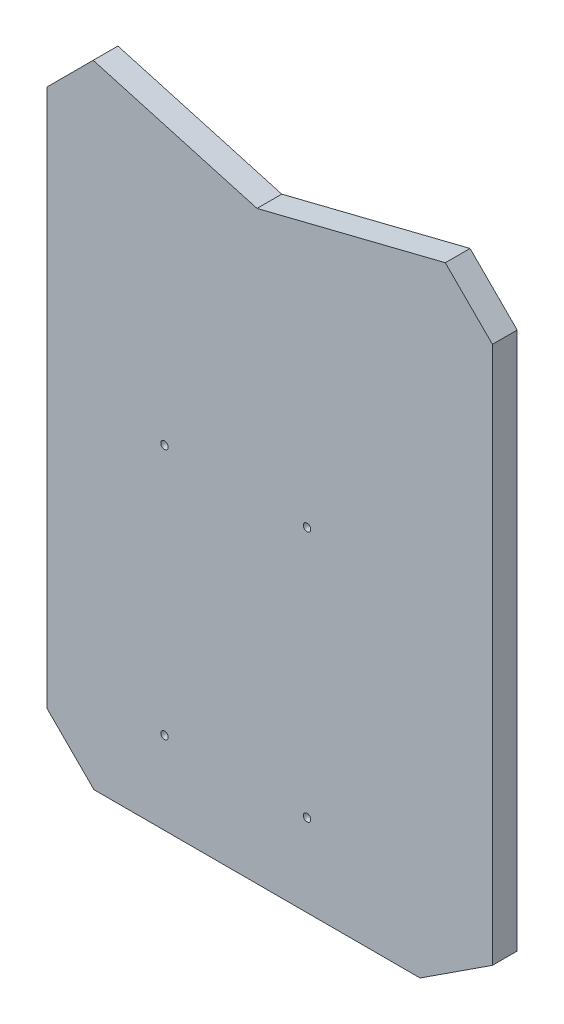
ISO-10303-21;
HEADER;
FILE_DESCRIPTION(('STEP AP214'),'2;1');
FILE_NAME('part.step','',(''),(''),'','','');
FILE_SCHEMA(('AUTOMOTIVE_DESIGN { 1 0 10303 214 1 1 1 1 }'));
ENDSEC;
DATA;
#1=APPLICATION_CONTEXT('core data for automotive mechanical design processes');
#2=APPLICATION_PROTOCOL_DEFINITION('international standard','automotive_design',2000,#1);
#3=PRODUCT_CONTEXT('',#1,'mechanical');
#4=PRODUCT('Part','Part','',(#3));
#5=PRODUCT_RELATED_PRODUCT_CATEGORY('part','',(#4));
#6=PRODUCT_DEFINITION_FORMATION('','',#4);
#7=PRODUCT_DEFINITION_CONTEXT('part definition',#1,'design');
#8=PRODUCT_DEFINITION('design','',#6,#7);
#9=PRODUCT_DEFINITION_SHAPE('','',#8);
#10=(LENGTH_UNIT() NAMED_UNIT(*) SI_UNIT(.MILLI.,.METRE.));
#11=(NAMED_UNIT(*) PLANE_ANGLE_UNIT() SI_UNIT($,.RADIAN.));
#12=(NAMED_UNIT(*) SI_UNIT($,.STERADIAN.) SOLID_ANGLE_UNIT());
#13=UNCERTAINTY_MEASURE_WITH_UNIT(LENGTH_MEASURE(1.E-05),#10,'distance_accuracy_value','');
#14=(GEOMETRIC_REPRESENTATION_CONTEXT(3) GLOBAL_UNCERTAINTY_ASSIGNED_CONTEXT((#13)) GLOBAL_UNIT_ASSIGNED_CONTEXT((#10,
#11,#12)) REPRESENTATION_CONTEXT('',''));
#15=CARTESIAN_POINT('',(0.,0.,0.));
#16=DIRECTION('',(0.,0.,1.));
#17=DIRECTION('',(1.,0.,0.));
#18=AXIS2_PLACEMENT_3D('',#15,#16,#17);
#19=CARTESIAN_POINT('',(-95.9896856118364,-47.8767409493786,10.));
#20=DIRECTION('',(-0.545817592000617,0.8379040256871,0.));
#21=DIRECTION('',(-0.8379040256871,-0.545817592000617,0.));
#22=AXIS2_PLACEMENT_3D('',#19,#20,#21);
#23=PLANE('',#22);
#24=DIRECTION('',(0.8379040256871,0.545817592000617,0.));
#25=VECTOR('',#24,1.);
#26=CARTESIAN_POINT('',(-95.9896856118364,-47.8767409493786,0.));
#27=LINE('',#26,#25);
#28=CARTESIAN_POINT('',(-125.221881909842,-66.9188346774557,0.));
#29=VERTEX_POINT('',#28);
#30=CARTESIAN_POINT('',(-95.9896856118364,-47.8767409493786,0.));
#31=VERTEX_POINT('',#30);
#32=EDGE_CURVE('E139',#29,#31,#27,.T.);
#33=ORIENTED_EDGE('',*,*,#32,.T.);
#34=DIRECTION('',(0.,0.,-1.));
#35=VECTOR('',#34,1.);
#36=CARTESIAN_POINT('',(-95.9896856118364,-47.8767409493786,10.));
#37=LINE('',#36,#35);
#38=CARTESIAN_POINT('',(-95.9896856118364,-47.8767409493786,10.));
#39=VERTEX_POINT('',#38);
#40=EDGE_CURVE('E11',#39,#31,#37,.T.);
#41=ORIENTED_EDGE('',*,*,#40,.F.);
#42=DIRECTION('',(0.8379040256871,0.545817592000617,0.));
#43=VECTOR('',#42,1.);
#44=CARTESIAN_POINT('',(-95.9896856118364,-47.8767409493786,10.));
#45=LINE('',#44,#43);
#46=CARTESIAN_POINT('',(-125.221881909842,-66.9188346774557,10.));
#47=VERTEX_POINT('',#46);
#48=EDGE_CURVE('E157',#47,#39,#45,.T.);
#49=ORIENTED_EDGE('',*,*,#48,.F.);
#50=DIRECTION('',(0.,0.,-1.));
#51=VECTOR('',#50,1.);
#52=CARTESIAN_POINT('',(-125.221881909842,-66.9188346774557,10.));
#53=LINE('',#52,#51);
#54=EDGE_CURVE('E135',#47,#29,#53,.T.);
#55=ORIENTED_EDGE('',*,*,#54,.T.);
#56=EDGE_LOOP('',(#33,#41,#49,#55));
#57=FACE_BOUND('',#56,.T.);
#58=ADVANCED_FACE('F37',(#57),#23,.F.);
#59=CARTESIAN_POINT('',(-95.9896856118364,169.449737011339,10.));
#60=DIRECTION('',(-1.,0.,0.));
#61=DIRECTION('',(0.,0.,1.));
#62=AXIS2_PLACEMENT_3D('',#59,#60,#61);
#63=PLANE('',#62);
#64=DIRECTION('',(0.,1.,0.));
#65=VECTOR('',#64,1.);
#66=CARTESIAN_POINT('',(-95.9896856118364,169.449737011339,0.));
#67=LINE('',#66,#65);
#68=CARTESIAN_POINT('',(-95.9896856118364,169.449737011339,0.));
#69=VERTEX_POINT('',#68);
#70=EDGE_CURVE('E142',#31,#69,#67,.T.);
#71=ORIENTED_EDGE('',*,*,#70,.T.);
#72=DIRECTION('',(0.,0.,-1.));
#73=VECTOR('',#72,1.);
#74=CARTESIAN_POINT('',(-95.9896856118364,169.449737011339,10.));
#75=LINE('',#74,#73);
#76=CARTESIAN_POINT('',(-95.9896856118364,169.449737011339,10.));
#77=VERTEX_POINT('',#76);
#78=EDGE_CURVE('E45',#77,#69,#75,.T.);
#79=ORIENTED_EDGE('',*,*,#78,.F.);
#80=DIRECTION('',(0.,1.,0.));
#81=VECTOR('',#80,1.);
#82=CARTESIAN_POINT('',(-95.9896856118364,169.449737011339,10.));
#83=LINE('',#82,#81);
#84=EDGE_CURVE('E99',#39,#77,#83,.T.);
#85=ORIENTED_EDGE('',*,*,#84,.F.);
#86=ORIENTED_EDGE('',*,*,#40,.T.);
#87=EDGE_LOOP('',(#71,#79,#85,#86));
#88=FACE_BOUND('',#87,.T.);
#89=ADVANCED_FACE('F175',(#88),#63,.F.);
#90=CARTESIAN_POINT('',(-115.031779339913,188.491830739415,10.));
#91=DIRECTION('',(-0.70710678118654,-0.707106781186555,0.));
#92=DIRECTION('',(0.707106781186555,-0.70710678118654,0.));
#93=AXIS2_PLACEMENT_3D('',#90,#91,#92);
#94=PLANE('',#93);
#95=DIRECTION('',(-0.707106781186555,0.70710678118654,0.));
#96=VECTOR('',#95,1.);
#97=CARTESIAN_POINT('',(-115.031779339913,188.491830739415,0.));
#98=LINE('',#97,#96);
#99=CARTESIAN_POINT('',(-115.031779339913,188.491830739415,0.));
#100=VERTEX_POINT('',#99);
#101=EDGE_CURVE('E146',#69,#100,#98,.T.);
#102=ORIENTED_EDGE('',*,*,#101,.T.);
#103=DIRECTION('',(0.,0.,-1.));
#104=VECTOR('',#103,1.);
#105=CARTESIAN_POINT('',(-115.031779339913,188.491830739415,10.));
#106=LINE('',#105,#104);
#107=CARTESIAN_POINT('',(-115.031779339913,188.491830739415,10.));
#108=VERTEX_POINT('',#107);
#109=EDGE_CURVE('E167',#108,#100,#106,.T.);
#110=ORIENTED_EDGE('',*,*,#109,.F.);
#111=DIRECTION('',(-0.707106781186555,0.70710678118654,0.));
#112=VECTOR('',#111,1.);
#113=CARTESIAN_POINT('',(-101.507171045915,174.967222445418,10.));
#114=LINE('',#113,#112);
#115=EDGE_CURVE('E174',#77,#108,#114,.T.);
#116=ORIENTED_EDGE('',*,*,#115,.F.);
#117=ORIENTED_EDGE('',*,*,#78,.T.);
#118=EDGE_LOOP('',(#102,#110,#116,#117));
#119=FACE_BOUND('',#118,.T.);
#120=ADVANCED_FACE('F172',(#119),#94,.F.);
#121=CARTESIAN_POINT('',(-115.031779339913,188.491830739415,10.));
#122=DIRECTION('',(0.242771295166714,-0.970083552196962,0.));
#123=DIRECTION('',(0.970083552196962,0.242771295166714,0.));
#124=AXIS2_PLACEMENT_3D('',#121,#122,#123);
#125=PLANE('',#124);
#126=DIRECTION('',(-0.970083552196962,-0.242771295166714,0.));
#127=VECTOR('',#126,1.);
#128=CARTESIAN_POINT('',(-115.031779339913,188.491830739415,0.));
#129=LINE('',#128,#127);
#130=CARTESIAN_POINT('',(-191.121590173251,169.449737011339,0.));
#131=VERTEX_POINT('',#130);
#132=EDGE_CURVE('E148',#100,#131,#129,.T.);
#133=ORIENTED_EDGE('',*,*,#132,.T.);
#134=DIRECTION('',(0.,0.,-1.));
#135=VECTOR('',#134,1.);
#136=CARTESIAN_POINT('',(-191.121590173251,169.449737011339,10.));
#137=LINE('',#136,#135);
#138=CARTESIAN_POINT('',(-191.121590173251,169.449737011339,10.));
#139=VERTEX_POINT('',#138);
#140=EDGE_CURVE('E164',#139,#131,#137,.T.);
#141=ORIENTED_EDGE('',*,*,#140,.F.);
#142=DIRECTION('',(-0.970083552196962,-0.242771295166714,0.));
#143=VECTOR('',#142,1.);
#144=CARTESIAN_POINT('',(-115.031779339913,188.491830739415,10.));
#145=LINE('',#144,#143);
#146=EDGE_CURVE('E192',#108,#139,#145,.T.);
#147=ORIENTED_EDGE('',*,*,#146,.F.);
#148=ORIENTED_EDGE('',*,*,#109,.T.);
#149=EDGE_LOOP('',(#133,#141,#147,#148));
#150=FACE_BOUND('',#149,.T.);
#151=ADVANCED_FACE('F185',(#150),#125,.F.);
#152=CARTESIAN_POINT('',(-257.328922186424,188.184206989653,10.));
#153=DIRECTION('',(-0.272275987356531,-0.962219198888188,0.));
#154=DIRECTION('',(0.962219198888188,-0.272275987356531,0.));
#155=AXIS2_PLACEMENT_3D('',#152,#153,#154);
#156=PLANE('',#155);
#157=DIRECTION('',(-0.962219198888188,0.272275987356531,0.));
#158=VECTOR('',#157,1.);
#159=CARTESIAN_POINT('',(-257.328922186424,188.184206989653,0.));
#160=LINE('',#159,#158);
#161=CARTESIAN_POINT('',(-257.328922186424,188.184206989653,0.));
#162=VERTEX_POINT('',#161);
#163=EDGE_CURVE('E150',#131,#162,#160,.T.);
#164=ORIENTED_EDGE('',*,*,#163,.T.);
#165=DIRECTION('',(0.,0.,-1.));
#166=VECTOR('',#165,1.);
#167=CARTESIAN_POINT('',(-257.328922186424,188.184206989653,10.));
#168=LINE('',#167,#166);
#169=CARTESIAN_POINT('',(-257.328922186424,188.184206989653,10.));
#170=VERTEX_POINT('',#169);
#171=EDGE_CURVE('E161',#170,#162,#168,.T.);
#172=ORIENTED_EDGE('',*,*,#171,.F.);
#173=DIRECTION('',(-0.962219198888188,0.272275987356531,0.));
#174=VECTOR('',#173,1.);
#175=CARTESIAN_POINT('',(-257.328922186424,188.184206989653,10.));
#176=LINE('',#175,#174);
#177=EDGE_CURVE('E191',#139,#170,#176,.T.);
#178=ORIENTED_EDGE('',*,*,#177,.F.);
#179=ORIENTED_EDGE('',*,*,#140,.T.);
#180=EDGE_LOOP('',(#164,#172,#178,#179));
#181=FACE_BOUND('',#180,.T.);
#182=ADVANCED_FACE('F189',(#181),#156,.F.);
#183=CARTESIAN_POINT('',(-257.328922186424,188.184206989653,10.));
#184=DIRECTION('',(0.707106781186554,-0.707106781186541,0.));
#185=DIRECTION('',(0.707106781186541,0.707106781186554,0.));
#186=AXIS2_PLACEMENT_3D('',#183,#184,#185);
#187=PLANE('',#186);
#188=DIRECTION('',(-0.707106781186541,-0.707106781186554,0.));
#189=VECTOR('',#188,1.);
#190=CARTESIAN_POINT('',(-257.328922186424,188.184206989653,0.));
#191=LINE('',#190,#189);
#192=CARTESIAN_POINT('',(-276.063392164738,169.449737011339,0.));
#193=VERTEX_POINT('',#192);
#194=EDGE_CURVE('E152',#162,#193,#191,.T.);
#195=ORIENTED_EDGE('',*,*,#194,.T.);
#196=DIRECTION('',(0.,0.,-1.));
#197=VECTOR('',#196,1.);
#198=CARTESIAN_POINT('',(-276.063392164738,169.449737011339,10.));
#199=LINE('',#198,#197);
#200=CARTESIAN_POINT('',(-276.063392164738,169.449737011339,10.));
#201=VERTEX_POINT('',#200);
#202=EDGE_CURVE('E130',#201,#193,#199,.T.);
#203=ORIENTED_EDGE('',*,*,#202,.F.);
#204=DIRECTION('',(-0.707106781186541,-0.707106781186554,0.));
#205=VECTOR('',#204,1.);
#206=CARTESIAN_POINT('',(-257.328922186424,188.184206989653,10.));
#207=LINE('',#206,#205);
#208=EDGE_CURVE('E121',#170,#201,#207,.T.);
#209=ORIENTED_EDGE('',*,*,#208,.F.);
#210=ORIENTED_EDGE('',*,*,#171,.T.);
#211=EDGE_LOOP('',(#195,#203,#209,#210));
#212=FACE_BOUND('',#211,.T.);
#213=ADVANCED_FACE('F255',(#212),#187,.F.);
#214=CARTESIAN_POINT('',(-276.063392164738,169.449737011339,10.));
#215=DIRECTION('',(1.,0.,0.));
#216=DIRECTION('',(0.,0.,-1.));
#217=AXIS2_PLACEMENT_3D('',#214,#215,#216);
#218=PLANE('',#217);
#219=DIRECTION('',(0.,-1.,0.));
#220=VECTOR('',#219,1.);
#221=CARTESIAN_POINT('',(-276.063392164738,169.449737011339,0.));
#222=LINE('',#221,#220);
#223=CARTESIAN_POINT('',(-276.063392164738,-47.8767409493786,0.));
#224=VERTEX_POINT('',#223);
#225=EDGE_CURVE('E129',#193,#224,#222,.T.);
#226=ORIENTED_EDGE('',*,*,#225,.T.);
#227=DIRECTION('',(0.,0.,-1.));
#228=VECTOR('',#227,1.);
#229=CARTESIAN_POINT('',(-276.063392164738,-47.8767409493786,10.));
#230=LINE('',#229,#228);
#231=CARTESIAN_POINT('',(-276.063392164738,-47.8767409493786,10.));
#232=VERTEX_POINT('',#231);
#233=EDGE_CURVE('E126',#232,#224,#230,.T.);
#234=ORIENTED_EDGE('',*,*,#233,.F.);
#235=DIRECTION('',(0.,-1.,0.));
#236=VECTOR('',#235,1.);
#237=CARTESIAN_POINT('',(-276.063392164738,169.449737011339,10.));
#238=LINE('',#237,#236);
#239=EDGE_CURVE('E115',#201,#232,#238,.T.);
#240=ORIENTED_EDGE('',*,*,#239,.F.);
#241=ORIENTED_EDGE('',*,*,#202,.T.);
#242=EDGE_LOOP('',(#226,#234,#240,#241));
#243=FACE_BOUND('',#242,.T.);
#244=ADVANCED_FACE('F127',(#243),#218,.F.);
#245=CARTESIAN_POINT('',(-276.063392164738,-47.8767409493786,10.));
#246=DIRECTION('',(0.707106781186541,0.707106781186554,0.));
#247=DIRECTION('',(-0.707106781186554,0.707106781186541,0.));
#248=AXIS2_PLACEMENT_3D('',#245,#246,#247);
#249=PLANE('',#248);
#250=DIRECTION('',(0.707106781186554,-0.707106781186541,0.));
#251=VECTOR('',#250,1.);
#252=CARTESIAN_POINT('',(-276.063392164738,-47.8767409493786,0.));
#253=LINE('',#252,#251);
#254=CARTESIAN_POINT('',(-257.021298436661,-66.9188346774557,0.));
#255=VERTEX_POINT('',#254);
#256=EDGE_CURVE('E85',#224,#255,#253,.T.);
#257=ORIENTED_EDGE('',*,*,#256,.T.);
#258=DIRECTION('',(0.,0.,-1.));
#259=VECTOR('',#258,1.);
#260=CARTESIAN_POINT('',(-257.021298436661,-66.9188346774557,10.));
#261=LINE('',#260,#259);
#262=CARTESIAN_POINT('',(-257.021298436661,-66.9188346774557,10.));
#263=VERTEX_POINT('',#262);
#264=EDGE_CURVE('E131',#263,#255,#261,.T.);
#265=ORIENTED_EDGE('',*,*,#264,.F.);
#266=DIRECTION('',(0.707106781186554,-0.707106781186541,0.));
#267=VECTOR('',#266,1.);
#268=CARTESIAN_POINT('',(-276.063392164738,-47.8767409493786,10.));
#269=LINE('',#268,#267);
#270=EDGE_CURVE('E119',#232,#263,#269,.T.);
#271=ORIENTED_EDGE('',*,*,#270,.F.);
#272=ORIENTED_EDGE('',*,*,#233,.T.);
#273=EDGE_LOOP('',(#257,#265,#271,#272));
#274=FACE_BOUND('',#273,.T.);
#275=ADVANCED_FACE('F133',(#274),#249,.F.);
#276=CARTESIAN_POINT('',(-125.221881909842,-66.9188346774557,10.));
#277=DIRECTION('',(0.,1.,0.));
#278=DIRECTION('',(0.,0.,1.));
#279=AXIS2_PLACEMENT_3D('',#276,#277,#278);
#280=PLANE('',#279);
#281=DIRECTION('',(1.,0.,0.));
#282=VECTOR('',#281,1.);
#283=CARTESIAN_POINT('',(-125.221881909842,-66.9188346774557,0.));
#284=LINE('',#283,#282);
#285=EDGE_CURVE('E91',#255,#29,#284,.T.);
#286=ORIENTED_EDGE('',*,*,#285,.T.);
#287=ORIENTED_EDGE('',*,*,#54,.F.);
#288=DIRECTION('',(1.,0.,0.));
#289=VECTOR('',#288,1.);
#290=CARTESIAN_POINT('',(-125.221881909842,-66.9188346774557,10.));
#291=LINE('',#290,#289);
#292=EDGE_CURVE('E53',#263,#47,#291,.T.);
#293=ORIENTED_EDGE('',*,*,#292,.F.);
#294=ORIENTED_EDGE('',*,*,#264,.T.);
#295=EDGE_LOOP('',(#286,#287,#293,#294));
#296=FACE_BOUND('',#295,.T.);
#297=ADVANCED_FACE('F253',(#296),#280,.F.);
#298=CARTESIAN_POINT('',(0.,0.,10.));
#299=DIRECTION('',(0.,0.,1.));
#300=DIRECTION('',(1.,0.,0.));
#301=AXIS2_PLACEMENT_3D('',#298,#299,#300);
#302=PLANE('',#301);
#303=CARTESIAN_POINT('',(-170.9106552506,67.9166318223418,10.));
#304=DIRECTION('',(0.,0.,-1.));
#305=DIRECTION('',(-1.,0.,0.));
#306=AXIS2_PLACEMENT_3D('',#303,#304,#305);
#307=CIRCLE('',#306,1.5);
#308=CARTESIAN_POINT('',(-172.4106552506,67.9166318223418,10.));
#309=VERTEX_POINT('',#308);
#310=EDGE_CURVE('E216',#309,#309,#307,.T.);
#311=ORIENTED_EDGE('',*,*,#310,.T.);
#312=EDGE_LOOP('',(#311));
#313=FACE_BOUND('',#312,.T.);
#314=CARTESIAN_POINT('',(-228.522136284805,67.9166318223418,10.));
#315=DIRECTION('',(0.,0.,-1.));
#316=DIRECTION('',(-1.,0.,0.));
#317=AXIS2_PLACEMENT_3D('',#314,#315,#316);
#318=CIRCLE('',#317,1.5);
#319=CARTESIAN_POINT('',(-230.022136284805,67.9166318223418,10.));
#320=VERTEX_POINT('',#319);
#321=EDGE_CURVE('E210',#320,#320,#318,.T.);
#322=ORIENTED_EDGE('',*,*,#321,.T.);
#323=EDGE_LOOP('',(#322));
#324=FACE_BOUND('',#323,.T.);
#325=CARTESIAN_POINT('',(-228.522136284805,-33.6164733666544,10.));
#326=DIRECTION('',(0.,0.,-1.));
#327=DIRECTION('',(-1.,0.,0.));
#328=AXIS2_PLACEMENT_3D('',#325,#326,#327);
#329=CIRCLE('',#328,1.5);
#330=CARTESIAN_POINT('',(-230.022136284805,-33.6164733666544,10.));
#331=VERTEX_POINT('',#330);
#332=EDGE_CURVE('E204',#331,#331,#329,.T.);
#333=ORIENTED_EDGE('',*,*,#332,.T.);
#334=EDGE_LOOP('',(#333));
#335=FACE_BOUND('',#334,.T.);
#336=CARTESIAN_POINT('',(-170.9106552506,-33.6164733666544,10.));
#337=DIRECTION('',(0.,0.,-1.));
#338=DIRECTION('',(-1.,0.,0.));
#339=AXIS2_PLACEMENT_3D('',#336,#337,#338);
#340=CIRCLE('',#339,1.5);
#341=CARTESIAN_POINT('',(-172.4106552506,-33.6164733666544,10.));
#342=VERTEX_POINT('',#341);
#343=EDGE_CURVE('E143',#342,#342,#340,.T.);
#344=ORIENTED_EDGE('',*,*,#343,.T.);
#345=EDGE_LOOP('',(#344));
#346=FACE_BOUND('',#345,.T.);
#347=ORIENTED_EDGE('',*,*,#48,.T.);
#348=ORIENTED_EDGE('',*,*,#84,.T.);
#349=ORIENTED_EDGE('',*,*,#115,.T.);
#350=ORIENTED_EDGE('',*,*,#146,.T.);
#351=ORIENTED_EDGE('',*,*,#177,.T.);
#352=ORIENTED_EDGE('',*,*,#208,.T.);
#353=ORIENTED_EDGE('',*,*,#239,.T.);
#354=ORIENTED_EDGE('',*,*,#270,.T.);
#355=ORIENTED_EDGE('',*,*,#292,.T.);
#356=EDGE_LOOP('',(#347,#348,#349,#350,#351,#352,#353,#354,#355));
#357=FACE_BOUND('',#356,.T.);
#358=ADVANCED_FACE('F117',(#313,#324,#335,#346,#357),#302,.T.);
#359=CARTESIAN_POINT('',(0.,0.,0.));
#360=DIRECTION('',(0.,0.,1.));
#361=DIRECTION('',(1.,0.,0.));
#362=AXIS2_PLACEMENT_3D('',#359,#360,#361);
#363=PLANE('',#362);
#364=CARTESIAN_POINT('',(-170.9106552506,67.9166318223418,0.));
#365=DIRECTION('',(0.,0.,-1.));
#366=DIRECTION('',(-1.,0.,0.));
#367=AXIS2_PLACEMENT_3D('',#364,#365,#366);
#368=CIRCLE('',#367,1.5);
#369=CARTESIAN_POINT('',(-172.4106552506,67.9166318223418,0.));
#370=VERTEX_POINT('',#369);
#371=EDGE_CURVE('E219',#370,#370,#368,.T.);
#372=ORIENTED_EDGE('',*,*,#371,.F.);
#373=EDGE_LOOP('',(#372));
#374=FACE_BOUND('',#373,.T.);
#375=CARTESIAN_POINT('',(-228.522136284805,67.9166318223418,0.));
#376=DIRECTION('',(0.,0.,-1.));
#377=DIRECTION('',(-1.,0.,0.));
#378=AXIS2_PLACEMENT_3D('',#375,#376,#377);
#379=CIRCLE('',#378,1.5);
#380=CARTESIAN_POINT('',(-230.022136284805,67.9166318223418,0.));
#381=VERTEX_POINT('',#380);
#382=EDGE_CURVE('E213',#381,#381,#379,.T.);
#383=ORIENTED_EDGE('',*,*,#382,.F.);
#384=EDGE_LOOP('',(#383));
#385=FACE_BOUND('',#384,.T.);
#386=CARTESIAN_POINT('',(-228.522136284805,-33.6164733666544,0.));
#387=DIRECTION('',(0.,0.,-1.));
#388=DIRECTION('',(-1.,0.,0.));
#389=AXIS2_PLACEMENT_3D('',#386,#387,#388);
#390=CIRCLE('',#389,1.5);
#391=CARTESIAN_POINT('',(-230.022136284805,-33.6164733666544,0.));
#392=VERTEX_POINT('',#391);
#393=EDGE_CURVE('E207',#392,#392,#390,.T.);
#394=ORIENTED_EDGE('',*,*,#393,.F.);
#395=EDGE_LOOP('',(#394));
#396=FACE_BOUND('',#395,.T.);
#397=CARTESIAN_POINT('',(-170.9106552506,-33.6164733666544,0.));
#398=DIRECTION('',(0.,0.,-1.));
#399=DIRECTION('',(-1.,0.,0.));
#400=AXIS2_PLACEMENT_3D('',#397,#398,#399);
#401=CIRCLE('',#400,1.5);
#402=CARTESIAN_POINT('',(-172.4106552506,-33.6164733666544,0.));
#403=VERTEX_POINT('',#402);
#404=EDGE_CURVE('E201',#403,#403,#401,.T.);
#405=ORIENTED_EDGE('',*,*,#404,.F.);
#406=EDGE_LOOP('',(#405));
#407=FACE_BOUND('',#406,.T.);
#408=ORIENTED_EDGE('',*,*,#32,.F.);
#409=ORIENTED_EDGE('',*,*,#285,.F.);
#410=ORIENTED_EDGE('',*,*,#256,.F.);
#411=ORIENTED_EDGE('',*,*,#225,.F.);
#412=ORIENTED_EDGE('',*,*,#194,.F.);
#413=ORIENTED_EDGE('',*,*,#163,.F.);
#414=ORIENTED_EDGE('',*,*,#132,.F.);
#415=ORIENTED_EDGE('',*,*,#101,.F.);
#416=ORIENTED_EDGE('',*,*,#70,.F.);
#417=EDGE_LOOP('',(#408,#409,#410,#411,#412,#413,#414,#415,#416));
#418=FACE_BOUND('',#417,.T.);
#419=ADVANCED_FACE('F179',(#374,#385,#396,#407,#418),#363,.F.);
#420=CARTESIAN_POINT('',(-170.9106552506,-33.6164733666544,0.));
#421=DIRECTION('',(0.,0.,-1.));
#422=DIRECTION('',(-1.,0.,0.));
#423=AXIS2_PLACEMENT_3D('',#420,#421,#422);
#424=CYLINDRICAL_SURFACE('',#423,1.5);
#425=ORIENTED_EDGE('',*,*,#343,.F.);
#426=EDGE_LOOP('',(#425));
#427=FACE_BOUND('',#426,.T.);
#428=ORIENTED_EDGE('',*,*,#404,.T.);
#429=EDGE_LOOP('',(#428));
#430=FACE_BOUND('',#429,.T.);
#431=ADVANCED_FACE('F227',(#427,#430),#424,.F.);
#432=CARTESIAN_POINT('',(-228.522136284805,-33.6164733666544,0.));
#433=DIRECTION('',(0.,0.,-1.));
#434=DIRECTION('',(-1.,0.,0.));
#435=AXIS2_PLACEMENT_3D('',#432,#433,#434);
#436=CYLINDRICAL_SURFACE('',#435,1.5);
#437=ORIENTED_EDGE('',*,*,#332,.F.);
#438=EDGE_LOOP('',(#437));
#439=FACE_BOUND('',#438,.T.);
#440=ORIENTED_EDGE('',*,*,#393,.T.);
#441=EDGE_LOOP('',(#440));
#442=FACE_BOUND('',#441,.T.);
#443=ADVANCED_FACE('F236',(#439,#442),#436,.F.);
#444=CARTESIAN_POINT('',(-228.522136284805,67.9166318223418,0.));
#445=DIRECTION('',(0.,0.,-1.));
#446=DIRECTION('',(-1.,0.,0.));
#447=AXIS2_PLACEMENT_3D('',#444,#445,#446);
#448=CYLINDRICAL_SURFACE('',#447,1.5);
#449=ORIENTED_EDGE('',*,*,#321,.F.);
#450=EDGE_LOOP('',(#449));
#451=FACE_BOUND('',#450,.T.);
#452=ORIENTED_EDGE('',*,*,#382,.T.);
#453=EDGE_LOOP('',(#452));
#454=FACE_BOUND('',#453,.T.);
#455=ADVANCED_FACE('F242',(#451,#454),#448,.F.);
#456=CARTESIAN_POINT('',(-170.9106552506,67.9166318223418,0.));
#457=DIRECTION('',(0.,0.,-1.));
#458=DIRECTION('',(-1.,0.,0.));
#459=AXIS2_PLACEMENT_3D('',#456,#457,#458);
#460=CYLINDRICAL_SURFACE('',#459,1.5);
#461=ORIENTED_EDGE('',*,*,#310,.F.);
#462=EDGE_LOOP('',(#461));
#463=FACE_BOUND('',#462,.T.);
#464=ORIENTED_EDGE('',*,*,#371,.T.);
#465=EDGE_LOOP('',(#464));
#466=FACE_BOUND('',#465,.T.);
#467=ADVANCED_FACE('F223',(#463,#466),#460,.F.);
#468=CLOSED_SHELL('',(#58,#89,#120,#151,#182,#213,#244,#275,#297,#358,#419,#431,#443,#455,#467));
#469=MANIFOLD_SOLID_BREP('B2',#468);
#470=ADVANCED_BREP_SHAPE_REPRESENTATION('',(#18,#469),#14);
#471=SHAPE_DEFINITION_REPRESENTATION(#9,#470);
ENDSEC;
END-ISO-10303-21;
